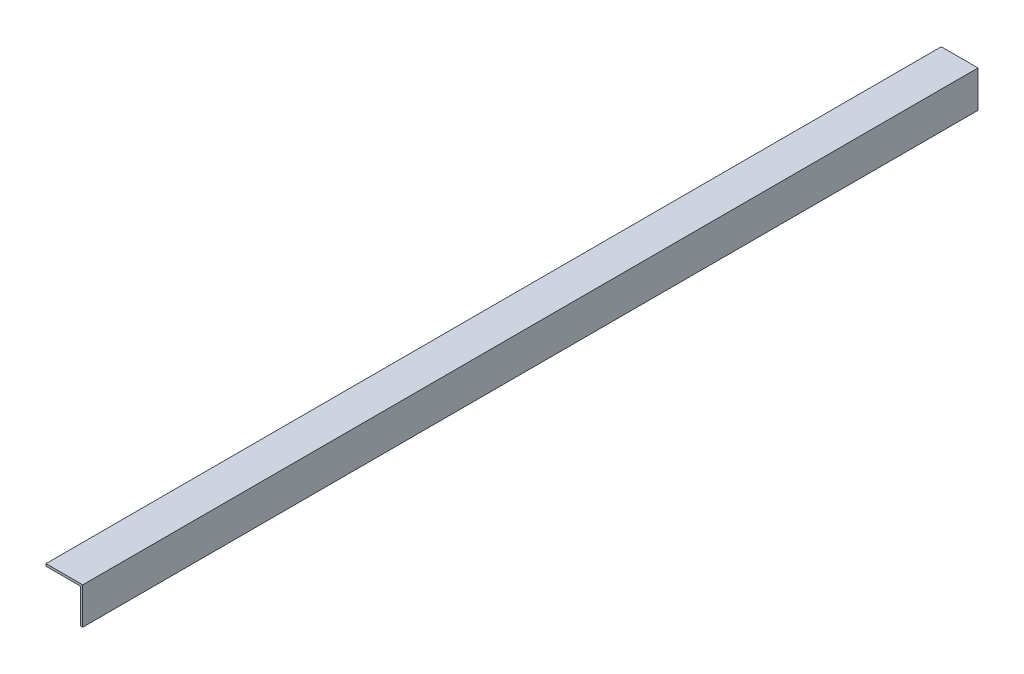
ISO-10303-21;
HEADER;
FILE_DESCRIPTION(('STEP AP214'),'2;1');
FILE_NAME('part.step','',(''),(''),'','','');
FILE_SCHEMA(('AUTOMOTIVE_DESIGN { 1 0 10303 214 1 1 1 1 }'));
ENDSEC;
DATA;
#1=APPLICATION_CONTEXT('core data for automotive mechanical design processes');
#2=APPLICATION_PROTOCOL_DEFINITION('international standard','automotive_design',2000,#1);
#3=PRODUCT_CONTEXT('',#1,'mechanical');
#4=PRODUCT('Part','Part','',(#3));
#5=PRODUCT_RELATED_PRODUCT_CATEGORY('part','',(#4));
#6=PRODUCT_DEFINITION_FORMATION('','',#4);
#7=PRODUCT_DEFINITION_CONTEXT('part definition',#1,'design');
#8=PRODUCT_DEFINITION('design','',#6,#7);
#9=PRODUCT_DEFINITION_SHAPE('','',#8);
#10=(LENGTH_UNIT() NAMED_UNIT(*) SI_UNIT(.MILLI.,.METRE.));
#11=(NAMED_UNIT(*) PLANE_ANGLE_UNIT() SI_UNIT($,.RADIAN.));
#12=(NAMED_UNIT(*) SI_UNIT($,.STERADIAN.) SOLID_ANGLE_UNIT());
#13=UNCERTAINTY_MEASURE_WITH_UNIT(LENGTH_MEASURE(1.E-05),#10,'distance_accuracy_value','');
#14=(GEOMETRIC_REPRESENTATION_CONTEXT(3) GLOBAL_UNCERTAINTY_ASSIGNED_CONTEXT((#13)) GLOBAL_UNIT_ASSIGNED_CONTEXT((#10,
#11,#12)) REPRESENTATION_CONTEXT('',''));
#15=CARTESIAN_POINT('',(0.,0.,0.));
#16=DIRECTION('',(0.,0.,1.));
#17=DIRECTION('',(1.,0.,0.));
#18=AXIS2_PLACEMENT_3D('',#15,#16,#17);
#19=CARTESIAN_POINT('',(662.,1074.,-800.));
#20=DIRECTION('',(1.,0.,0.));
#21=DIRECTION('',(0.,0.,-1.));
#22=AXIS2_PLACEMENT_3D('',#19,#20,#21);
#23=PLANE('',#22);
#24=DIRECTION('',(0.,1.,0.));
#25=VECTOR('',#24,1.);
#26=CARTESIAN_POINT('',(662.,1074.,-20.));
#27=LINE('',#26,#25);
#28=CARTESIAN_POINT('',(662.,1042.,-20.));
#29=VERTEX_POINT('',#28);
#30=CARTESIAN_POINT('',(662.,1074.,-20.));
#31=VERTEX_POINT('',#30);
#32=EDGE_CURVE('E124',#29,#31,#27,.T.);
#33=ORIENTED_EDGE('',*,*,#32,.F.);
#34=DIRECTION('',(0.,0.,1.));
#35=VECTOR('',#34,1.);
#36=CARTESIAN_POINT('',(662.,1042.,-800.));
#37=LINE('',#36,#35);
#38=CARTESIAN_POINT('',(662.,1042.,-800.));
#39=VERTEX_POINT('',#38);
#40=EDGE_CURVE('E11',#39,#29,#37,.T.);
#41=ORIENTED_EDGE('',*,*,#40,.F.);
#42=DIRECTION('',(0.,1.,0.));
#43=VECTOR('',#42,1.);
#44=CARTESIAN_POINT('',(662.,1074.,-800.));
#45=LINE('',#44,#43);
#46=CARTESIAN_POINT('',(662.,1074.,-800.));
#47=VERTEX_POINT('',#46);
#48=EDGE_CURVE('E138',#39,#47,#45,.T.);
#49=ORIENTED_EDGE('',*,*,#48,.T.);
#50=DIRECTION('',(0.,0.,1.));
#51=VECTOR('',#50,1.);
#52=CARTESIAN_POINT('',(662.,1074.,-800.));
#53=LINE('',#52,#51);
#54=EDGE_CURVE('E42',#47,#31,#53,.T.);
#55=ORIENTED_EDGE('',*,*,#54,.T.);
#56=EDGE_LOOP('',(#33,#41,#49,#55));
#57=FACE_BOUND('',#56,.T.);
#58=ADVANCED_FACE('F39',(#57),#23,.T.);
#59=CARTESIAN_POINT('',(662.,1042.,-800.));
#60=DIRECTION('',(0.,-1.,0.));
#61=DIRECTION('',(0.,0.,-1.));
#62=AXIS2_PLACEMENT_3D('',#59,#60,#61);
#63=PLANE('',#62);
#64=DIRECTION('',(1.,0.,0.));
#65=VECTOR('',#64,1.);
#66=CARTESIAN_POINT('',(662.,1042.,-20.));
#67=LINE('',#66,#65);
#68=CARTESIAN_POINT('',(660.,1042.,-20.));
#69=VERTEX_POINT('',#68);
#70=EDGE_CURVE('E136',#69,#29,#67,.T.);
#71=ORIENTED_EDGE('',*,*,#70,.F.);
#72=DIRECTION('',(0.,0.,1.));
#73=VECTOR('',#72,1.);
#74=CARTESIAN_POINT('',(660.,1042.,-800.));
#75=LINE('',#74,#73);
#76=CARTESIAN_POINT('',(660.,1042.,-800.));
#77=VERTEX_POINT('',#76);
#78=EDGE_CURVE('E48',#77,#69,#75,.T.);
#79=ORIENTED_EDGE('',*,*,#78,.F.);
#80=DIRECTION('',(1.,0.,0.));
#81=VECTOR('',#80,1.);
#82=CARTESIAN_POINT('',(662.,1042.,-800.));
#83=LINE('',#82,#81);
#84=EDGE_CURVE('E114',#77,#39,#83,.T.);
#85=ORIENTED_EDGE('',*,*,#84,.T.);
#86=ORIENTED_EDGE('',*,*,#40,.T.);
#87=EDGE_LOOP('',(#71,#79,#85,#86));
#88=FACE_BOUND('',#87,.T.);
#89=ADVANCED_FACE('F146',(#88),#63,.T.);
#90=CARTESIAN_POINT('',(660.,1042.,-800.));
#91=DIRECTION('',(-1.,0.,0.));
#92=DIRECTION('',(0.,0.,1.));
#93=AXIS2_PLACEMENT_3D('',#90,#91,#92);
#94=PLANE('',#93);
#95=DIRECTION('',(0.,-1.,0.));
#96=VECTOR('',#95,1.);
#97=CARTESIAN_POINT('',(660.,1042.,-20.));
#98=LINE('',#97,#96);
#99=CARTESIAN_POINT('',(660.,1072.,-20.));
#100=VERTEX_POINT('',#99);
#101=EDGE_CURVE('E101',#100,#69,#98,.T.);
#102=ORIENTED_EDGE('',*,*,#101,.F.);
#103=DIRECTION('',(0.,0.,1.));
#104=VECTOR('',#103,1.);
#105=CARTESIAN_POINT('',(660.,1072.,-800.));
#106=LINE('',#105,#104);
#107=CARTESIAN_POINT('',(660.,1072.,-800.));
#108=VERTEX_POINT('',#107);
#109=EDGE_CURVE('E96',#108,#100,#106,.T.);
#110=ORIENTED_EDGE('',*,*,#109,.F.);
#111=DIRECTION('',(0.,-1.,0.));
#112=VECTOR('',#111,1.);
#113=CARTESIAN_POINT('',(660.,1042.,-800.));
#114=LINE('',#113,#112);
#115=EDGE_CURVE('E99',#108,#77,#114,.T.);
#116=ORIENTED_EDGE('',*,*,#115,.T.);
#117=ORIENTED_EDGE('',*,*,#78,.T.);
#118=EDGE_LOOP('',(#102,#110,#116,#117));
#119=FACE_BOUND('',#118,.T.);
#120=ADVANCED_FACE('F98',(#119),#94,.T.);
#121=CARTESIAN_POINT('',(660.,1072.,-800.));
#122=DIRECTION('',(0.,-1.,0.));
#123=DIRECTION('',(0.,0.,-1.));
#124=AXIS2_PLACEMENT_3D('',#121,#122,#123);
#125=PLANE('',#124);
#126=DIRECTION('',(1.,0.,0.));
#127=VECTOR('',#126,1.);
#128=CARTESIAN_POINT('',(660.,1072.,-20.));
#129=LINE('',#128,#127);
#130=CARTESIAN_POINT('',(630.,1072.,-20.));
#131=VERTEX_POINT('',#130);
#132=EDGE_CURVE('E133',#131,#100,#129,.T.);
#133=ORIENTED_EDGE('',*,*,#132,.F.);
#134=DIRECTION('',(0.,0.,1.));
#135=VECTOR('',#134,1.);
#136=CARTESIAN_POINT('',(630.,1072.,-800.));
#137=LINE('',#136,#135);
#138=CARTESIAN_POINT('',(630.,1072.,-800.));
#139=VERTEX_POINT('',#138);
#140=EDGE_CURVE('E106',#139,#131,#137,.T.);
#141=ORIENTED_EDGE('',*,*,#140,.F.);
#142=DIRECTION('',(1.,0.,0.));
#143=VECTOR('',#142,1.);
#144=CARTESIAN_POINT('',(660.,1072.,-800.));
#145=LINE('',#144,#143);
#146=EDGE_CURVE('E112',#139,#108,#145,.T.);
#147=ORIENTED_EDGE('',*,*,#146,.T.);
#148=ORIENTED_EDGE('',*,*,#109,.T.);
#149=EDGE_LOOP('',(#133,#141,#147,#148));
#150=FACE_BOUND('',#149,.T.);
#151=ADVANCED_FACE('F116',(#150),#125,.T.);
#152=CARTESIAN_POINT('',(630.,1072.,-800.));
#153=DIRECTION('',(-1.,0.,0.));
#154=DIRECTION('',(0.,0.,1.));
#155=AXIS2_PLACEMENT_3D('',#152,#153,#154);
#156=PLANE('',#155);
#157=DIRECTION('',(0.,-1.,0.));
#158=VECTOR('',#157,1.);
#159=CARTESIAN_POINT('',(630.,1072.,-20.));
#160=LINE('',#159,#158);
#161=CARTESIAN_POINT('',(630.,1074.,-20.));
#162=VERTEX_POINT('',#161);
#163=EDGE_CURVE('E130',#162,#131,#160,.T.);
#164=ORIENTED_EDGE('',*,*,#163,.F.);
#165=DIRECTION('',(0.,0.,1.));
#166=VECTOR('',#165,1.);
#167=CARTESIAN_POINT('',(630.,1074.,-800.));
#168=LINE('',#167,#166);
#169=CARTESIAN_POINT('',(630.,1074.,-800.));
#170=VERTEX_POINT('',#169);
#171=EDGE_CURVE('E141',#170,#162,#168,.T.);
#172=ORIENTED_EDGE('',*,*,#171,.F.);
#173=DIRECTION('',(0.,-1.,0.));
#174=VECTOR('',#173,1.);
#175=CARTESIAN_POINT('',(630.,1072.,-800.));
#176=LINE('',#175,#174);
#177=EDGE_CURVE('E117',#170,#139,#176,.T.);
#178=ORIENTED_EDGE('',*,*,#177,.T.);
#179=ORIENTED_EDGE('',*,*,#140,.T.);
#180=EDGE_LOOP('',(#164,#172,#178,#179));
#181=FACE_BOUND('',#180,.T.);
#182=ADVANCED_FACE('F159',(#181),#156,.T.);
#183=CARTESIAN_POINT('',(630.,1074.,-800.));
#184=DIRECTION('',(0.,1.,0.));
#185=DIRECTION('',(0.,0.,1.));
#186=AXIS2_PLACEMENT_3D('',#183,#184,#185);
#187=PLANE('',#186);
#188=DIRECTION('',(-1.,0.,0.));
#189=VECTOR('',#188,1.);
#190=CARTESIAN_POINT('',(630.,1074.,-20.));
#191=LINE('',#190,#189);
#192=EDGE_CURVE('E127',#31,#162,#191,.T.);
#193=ORIENTED_EDGE('',*,*,#192,.F.);
#194=ORIENTED_EDGE('',*,*,#54,.F.);
#195=DIRECTION('',(-1.,0.,0.));
#196=VECTOR('',#195,1.);
#197=CARTESIAN_POINT('',(630.,1074.,-800.));
#198=LINE('',#197,#196);
#199=EDGE_CURVE('E119',#47,#170,#198,.T.);
#200=ORIENTED_EDGE('',*,*,#199,.T.);
#201=ORIENTED_EDGE('',*,*,#171,.T.);
#202=EDGE_LOOP('',(#193,#194,#200,#201));
#203=FACE_BOUND('',#202,.T.);
#204=ADVANCED_FACE('F143',(#203),#187,.T.);
#205=CARTESIAN_POINT('',(0.,0.,-800.));
#206=DIRECTION('',(0.,0.,-1.));
#207=DIRECTION('',(-1.,0.,0.));
#208=AXIS2_PLACEMENT_3D('',#205,#206,#207);
#209=PLANE('',#208);
#210=ORIENTED_EDGE('',*,*,#48,.F.);
#211=ORIENTED_EDGE('',*,*,#84,.F.);
#212=ORIENTED_EDGE('',*,*,#115,.F.);
#213=ORIENTED_EDGE('',*,*,#146,.F.);
#214=ORIENTED_EDGE('',*,*,#177,.F.);
#215=ORIENTED_EDGE('',*,*,#199,.F.);
#216=EDGE_LOOP('',(#210,#211,#212,#213,#214,#215));
#217=FACE_BOUND('',#216,.T.);
#218=ADVANCED_FACE('F110',(#217),#209,.T.);
#219=CARTESIAN_POINT('',(0.,0.,-20.));
#220=DIRECTION('',(0.,0.,-1.));
#221=DIRECTION('',(-1.,0.,0.));
#222=AXIS2_PLACEMENT_3D('',#219,#220,#221);
#223=PLANE('',#222);
#224=ORIENTED_EDGE('',*,*,#32,.T.);
#225=ORIENTED_EDGE('',*,*,#192,.T.);
#226=ORIENTED_EDGE('',*,*,#163,.T.);
#227=ORIENTED_EDGE('',*,*,#132,.T.);
#228=ORIENTED_EDGE('',*,*,#101,.T.);
#229=ORIENTED_EDGE('',*,*,#70,.T.);
#230=EDGE_LOOP('',(#224,#225,#226,#227,#228,#229));
#231=FACE_BOUND('',#230,.T.);
#232=ADVANCED_FACE('F145',(#231),#223,.F.);
#233=CLOSED_SHELL('',(#58,#89,#120,#151,#182,#204,#218,#232));
#234=MANIFOLD_SOLID_BREP('B2',#233);
#235=ADVANCED_BREP_SHAPE_REPRESENTATION('',(#18,#234),#14);
#236=SHAPE_DEFINITION_REPRESENTATION(#9,#235);
ENDSEC;
END-ISO-10303-21;
